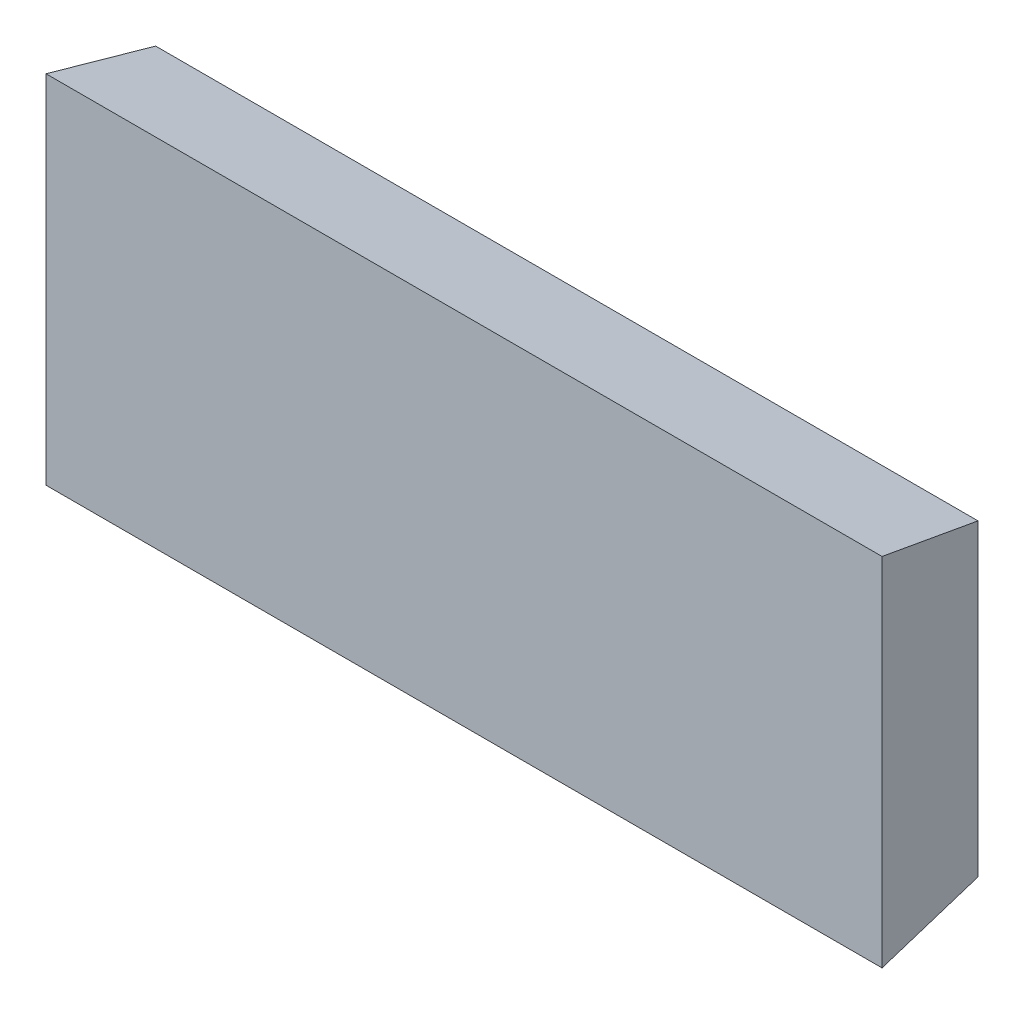
ISO-10303-21;
HEADER;
FILE_DESCRIPTION(('STEP AP214'),'2;1');
FILE_NAME('part.step','',(''),(''),'','','');
FILE_SCHEMA(('AUTOMOTIVE_DESIGN { 1 0 10303 214 1 1 1 1 }'));
ENDSEC;
DATA;
#1=APPLICATION_CONTEXT('core data for automotive mechanical design processes');
#2=APPLICATION_PROTOCOL_DEFINITION('international standard','automotive_design',2000,#1);
#3=PRODUCT_CONTEXT('',#1,'mechanical');
#4=PRODUCT('Part','Part','',(#3));
#5=PRODUCT_RELATED_PRODUCT_CATEGORY('part','',(#4));
#6=PRODUCT_DEFINITION_FORMATION('','',#4);
#7=PRODUCT_DEFINITION_CONTEXT('part definition',#1,'design');
#8=PRODUCT_DEFINITION('design','',#6,#7);
#9=PRODUCT_DEFINITION_SHAPE('','',#8);
#10=(LENGTH_UNIT() NAMED_UNIT(*) SI_UNIT(.MILLI.,.METRE.));
#11=(NAMED_UNIT(*) PLANE_ANGLE_UNIT() SI_UNIT($,.RADIAN.));
#12=(NAMED_UNIT(*) SI_UNIT($,.STERADIAN.) SOLID_ANGLE_UNIT());
#13=UNCERTAINTY_MEASURE_WITH_UNIT(LENGTH_MEASURE(1.E-05),#10,'distance_accuracy_value','');
#14=(GEOMETRIC_REPRESENTATION_CONTEXT(3) GLOBAL_UNCERTAINTY_ASSIGNED_CONTEXT((#13)) GLOBAL_UNIT_ASSIGNED_CONTEXT((#10,
#11,#12)) REPRESENTATION_CONTEXT('',''));
#15=CARTESIAN_POINT('',(0.,0.,0.));
#16=DIRECTION('',(0.,0.,1.));
#17=DIRECTION('',(1.,0.,0.));
#18=AXIS2_PLACEMENT_3D('',#15,#16,#17);
#19=CARTESIAN_POINT('',(80.,0.,0.));
#20=DIRECTION('',(0.,0.,1.));
#21=DIRECTION('',(1.,0.,0.));
#22=AXIS2_PLACEMENT_3D('',#19,#20,#21);
#23=PLANE('',#22);
#24=DIRECTION('',(0.,1.,0.));
#25=VECTOR('',#24,1.);
#26=CARTESIAN_POINT('',(0.,0.,0.));
#27=LINE('',#26,#25);
#28=CARTESIAN_POINT('',(0.,0.,0.));
#29=VERTEX_POINT('',#28);
#30=CARTESIAN_POINT('',(0.,29.9999999999992,0.));
#31=VERTEX_POINT('',#30);
#32=EDGE_CURVE('E105',#29,#31,#27,.T.);
#33=ORIENTED_EDGE('',*,*,#32,.T.);
#34=DIRECTION('',(-1.,0.,0.));
#35=VECTOR('',#34,1.);
#36=CARTESIAN_POINT('',(80.,29.9999999999992,0.));
#37=LINE('',#36,#35);
#38=CARTESIAN_POINT('',(80.,29.9999999999992,0.));
#39=VERTEX_POINT('',#38);
#40=EDGE_CURVE('E11',#39,#31,#37,.T.);
#41=ORIENTED_EDGE('',*,*,#40,.F.);
#42=DIRECTION('',(0.,1.,0.));
#43=VECTOR('',#42,1.);
#44=CARTESIAN_POINT('',(80.,0.,0.));
#45=LINE('',#44,#43);
#46=CARTESIAN_POINT('',(80.,0.,0.));
#47=VERTEX_POINT('',#46);
#48=EDGE_CURVE('E107',#47,#39,#45,.T.);
#49=ORIENTED_EDGE('',*,*,#48,.F.);
#50=DIRECTION('',(-1.,0.,0.));
#51=VECTOR('',#50,1.);
#52=CARTESIAN_POINT('',(80.,0.,0.));
#53=LINE('',#52,#51);
#54=EDGE_CURVE('E87',#47,#29,#53,.T.);
#55=ORIENTED_EDGE('',*,*,#54,.T.);
#56=EDGE_LOOP('',(#33,#41,#49,#55));
#57=FACE_BOUND('',#56,.T.);
#58=ADVANCED_FACE('F38',(#57),#23,.F.);
#59=CARTESIAN_POINT('',(80.,29.9999999999992,0.));
#60=DIRECTION('',(0.,-0.973841209741791,0.227229615606428));
#61=DIRECTION('',(0.,-0.227229615606428,-0.973841209741791));
#62=AXIS2_PLACEMENT_3D('',#59,#60,#61);
#63=PLANE('',#62);
#64=ORIENTED_EDGE('',*,*,#40,.T.);
#65=DIRECTION('',(0.064786354839175,-0.226752241937117,-0.971795322587603));
#66=VECTOR('',#65,1.);
#67=CARTESIAN_POINT('',(-0.798735825551808,32.7955753894306,11.9810373832768));
#68=LINE('',#67,#66);
#69=CARTESIAN_POINT('',(-0.666666666666683,32.3333333333326,10.));
#70=VERTEX_POINT('',#69);
#71=EDGE_CURVE('E58',#70,#31,#68,.T.);
#72=ORIENTED_EDGE('',*,*,#71,.F.);
#73=DIRECTION('',(-1.,0.,0.));
#74=VECTOR('',#73,1.);
#75=CARTESIAN_POINT('',(80.,32.3333333333326,10.));
#76=LINE('',#75,#74);
#77=CARTESIAN_POINT('',(80.6666666666667,32.3333333333326,10.));
#78=VERTEX_POINT('',#77);
#79=EDGE_CURVE('E45',#78,#70,#76,.T.);
#80=ORIENTED_EDGE('',*,*,#79,.F.);
#81=DIRECTION('',(0.0647863548391756,0.226752241937117,0.971795322587603));
#82=VECTOR('',#81,1.);
#83=CARTESIAN_POINT('',(80.7987358255518,32.7955753894306,11.9810373832768));
#84=LINE('',#83,#82);
#85=EDGE_CURVE('E94',#39,#78,#84,.T.);
#86=ORIENTED_EDGE('',*,*,#85,.F.);
#87=EDGE_LOOP('',(#64,#72,#80,#86));
#88=FACE_BOUND('',#87,.T.);
#89=ADVANCED_FACE('F111',(#88),#63,.F.);
#90=CARTESIAN_POINT('',(80.,32.3333333333326,10.));
#91=DIRECTION('',(0.,0.,-1.));
#92=DIRECTION('',(0.,1.,0.));
#93=AXIS2_PLACEMENT_3D('',#90,#91,#92);
#94=PLANE('',#93);
#95=ORIENTED_EDGE('',*,*,#79,.T.);
#96=DIRECTION('',(0.,-1.,0.));
#97=VECTOR('',#96,1.);
#98=CARTESIAN_POINT('',(-0.666666666666683,41.3234696488695,10.));
#99=LINE('',#98,#97);
#100=CARTESIAN_POINT('',(-0.666666666666683,-2.33333333333333,10.));
#101=VERTEX_POINT('',#100);
#102=EDGE_CURVE('E83',#70,#101,#99,.T.);
#103=ORIENTED_EDGE('',*,*,#102,.T.);
#104=DIRECTION('',(-1.,0.,0.));
#105=VECTOR('',#104,1.);
#106=CARTESIAN_POINT('',(80.,-2.33333333333333,9.99999999999999));
#107=LINE('',#106,#105);
#108=CARTESIAN_POINT('',(80.6666666666667,-2.33333333333333,10.));
#109=VERTEX_POINT('',#108);
#110=EDGE_CURVE('E78',#109,#101,#107,.T.);
#111=ORIENTED_EDGE('',*,*,#110,.F.);
#112=DIRECTION('',(0.,-1.,0.));
#113=VECTOR('',#112,1.);
#114=CARTESIAN_POINT('',(80.6666666666667,41.3234696488695,10.));
#115=LINE('',#114,#113);
#116=EDGE_CURVE('E81',#78,#109,#115,.T.);
#117=ORIENTED_EDGE('',*,*,#116,.F.);
#118=EDGE_LOOP('',(#95,#103,#111,#117));
#119=FACE_BOUND('',#118,.T.);
#120=ADVANCED_FACE('F80',(#119),#94,.F.);
#121=CARTESIAN_POINT('',(80.,-2.33333333333333,9.99999999999999));
#122=DIRECTION('',(0.,0.973841209741793,0.227229615606418));
#123=DIRECTION('',(0.,-0.227229615606418,0.973841209741793));
#124=AXIS2_PLACEMENT_3D('',#121,#122,#123);
#125=PLANE('',#124);
#126=ORIENTED_EDGE('',*,*,#110,.T.);
#127=DIRECTION('',(0.0647863548391751,0.226752241937108,-0.971795322587605));
#128=VECTOR('',#127,1.);
#129=CARTESIAN_POINT('',(-0.798735825551803,-2.79557538943125,11.9810373832768));
#130=LINE('',#129,#128);
#131=EDGE_CURVE('E101',#101,#29,#130,.T.);
#132=ORIENTED_EDGE('',*,*,#131,.T.);
#133=ORIENTED_EDGE('',*,*,#54,.F.);
#134=DIRECTION('',(0.0647863548391757,-0.226752241937108,0.971795322587605));
#135=VECTOR('',#134,1.);
#136=CARTESIAN_POINT('',(80.7987358255518,-2.79557538943125,11.9810373832768));
#137=LINE('',#136,#135);
#138=EDGE_CURVE('E93',#47,#109,#137,.T.);
#139=ORIENTED_EDGE('',*,*,#138,.T.);
#140=EDGE_LOOP('',(#126,#132,#133,#139));
#141=FACE_BOUND('',#140,.T.);
#142=ADVANCED_FACE('F97',(#141),#125,.F.);
#143=CARTESIAN_POINT('',(-0.666666666666683,41.3234696488695,10.));
#144=DIRECTION('',(0.997785157856609,0.,0.0665190105237754));
#145=DIRECTION('',(0.0665190105237754,0.,-0.997785157856609));
#146=AXIS2_PLACEMENT_3D('',#143,#144,#145);
#147=PLANE('',#146);
#148=ORIENTED_EDGE('',*,*,#102,.F.);
#149=ORIENTED_EDGE('',*,*,#71,.T.);
#150=ORIENTED_EDGE('',*,*,#32,.F.);
#151=ORIENTED_EDGE('',*,*,#131,.F.);
#152=EDGE_LOOP('',(#148,#149,#150,#151));
#153=FACE_BOUND('',#152,.T.);
#154=ADVANCED_FACE('F112',(#153),#147,.F.);
#155=CARTESIAN_POINT('',(80.6666666666667,41.3234696488695,10.));
#156=DIRECTION('',(-0.997785157856609,0.,0.066519010523776));
#157=DIRECTION('',(0.066519010523776,0.,0.997785157856609));
#158=AXIS2_PLACEMENT_3D('',#155,#156,#157);
#159=PLANE('',#158);
#160=ORIENTED_EDGE('',*,*,#48,.T.);
#161=ORIENTED_EDGE('',*,*,#85,.T.);
#162=ORIENTED_EDGE('',*,*,#116,.T.);
#163=ORIENTED_EDGE('',*,*,#138,.F.);
#164=EDGE_LOOP('',(#160,#161,#162,#163));
#165=FACE_BOUND('',#164,.T.);
#166=ADVANCED_FACE('F92',(#165),#159,.F.);
#167=CLOSED_SHELL('',(#58,#89,#120,#142,#154,#166));
#168=MANIFOLD_SOLID_BREP('B2',#167);
#169=ADVANCED_BREP_SHAPE_REPRESENTATION('',(#18,#168),#14);
#170=SHAPE_DEFINITION_REPRESENTATION(#9,#169);
ENDSEC;
END-ISO-10303-21;
